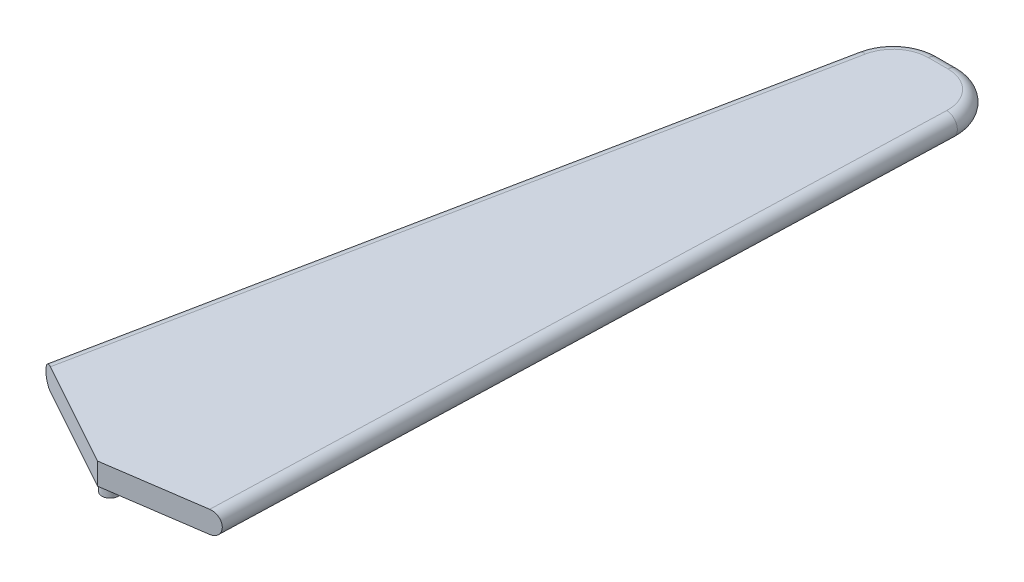
ISO-10303-21;
HEADER;
FILE_DESCRIPTION(('STEP AP214'),'2;1');
FILE_NAME('part.step','',(''),(''),'','','');
FILE_SCHEMA(('AUTOMOTIVE_DESIGN { 1 0 10303 214 1 1 1 1 }'));
ENDSEC;
DATA;
#1=APPLICATION_CONTEXT('core data for automotive mechanical design processes');
#2=APPLICATION_PROTOCOL_DEFINITION('international standard','automotive_design',2000,#1);
#3=PRODUCT_CONTEXT('',#1,'mechanical');
#4=PRODUCT('Part','Part','',(#3));
#5=PRODUCT_RELATED_PRODUCT_CATEGORY('part','',(#4));
#6=PRODUCT_DEFINITION_FORMATION('','',#4);
#7=PRODUCT_DEFINITION_CONTEXT('part definition',#1,'design');
#8=PRODUCT_DEFINITION('design','',#6,#7);
#9=PRODUCT_DEFINITION_SHAPE('','',#8);
#10=(LENGTH_UNIT() NAMED_UNIT(*) SI_UNIT(.MILLI.,.METRE.));
#11=(NAMED_UNIT(*) PLANE_ANGLE_UNIT() SI_UNIT($,.RADIAN.));
#12=(NAMED_UNIT(*) SI_UNIT($,.STERADIAN.) SOLID_ANGLE_UNIT());
#13=UNCERTAINTY_MEASURE_WITH_UNIT(LENGTH_MEASURE(1.E-05),#10,'distance_accuracy_value','');
#14=(GEOMETRIC_REPRESENTATION_CONTEXT(3) GLOBAL_UNCERTAINTY_ASSIGNED_CONTEXT((#13)) GLOBAL_UNIT_ASSIGNED_CONTEXT((#10,
#11,#12)) REPRESENTATION_CONTEXT('',''));
#15=CARTESIAN_POINT('',(0.,0.,0.));
#16=DIRECTION('',(0.,0.,1.));
#17=DIRECTION('',(1.,0.,0.));
#18=AXIS2_PLACEMENT_3D('',#15,#16,#17);
#19=CARTESIAN_POINT('',(268.196602974786,2.03230311549263,-4129.34647355135));
#20=DIRECTION('',(-0.0324574224863684,0.,0.999473119061009));
#21=DIRECTION('',(-0.999473119061009,0.,-0.0324574224863684));
#22=AXIS2_PLACEMENT_3D('',#19,#20,#21);
#23=CYLINDRICAL_SURFACE('',#22,30.);
#24=CARTESIAN_POINT('',(204.415988201948,2.03230311549263,-2165.3269951282));
#25=DIRECTION('',(0.144215427871348,0.,0.989546315421307));
#26=DIRECTION('',(-0.989546315421307,0.,0.144215427871348));
#27=AXIS2_PLACEMENT_3D('',#24,#25,#26);
#28=ELLIPSE('',#27,30.477147748641,30.);
#29=CARTESIAN_POINT('',(204.415988201949,32.0323031154927,-2165.3269951282));
#30=VERTEX_POINT('',#29);
#31=CARTESIAN_POINT('',(204.415988201949,-27.9676968845074,-2165.3269951282));
#32=VERTEX_POINT('',#31);
#33=EDGE_CURVE('E194',#30,#32,#28,.F.);
#34=ORIENTED_EDGE('',*,*,#33,.T.);
#35=DIRECTION('',(0.0324574224863683,0.,-0.999473119061009));
#36=VECTOR('',#35,1.);
#37=CARTESIAN_POINT('',(268.196602974786,-27.9676968845074,-4129.34647355135));
#38=LINE('',#37,#36);
#39=CARTESIAN_POINT('',(268.196602974786,-27.9676968845074,-4129.34647355135));
#40=VERTEX_POINT('',#39);
#41=EDGE_CURVE('E179',#32,#40,#38,.T.);
#42=ORIENTED_EDGE('',*,*,#41,.T.);
#43=CARTESIAN_POINT('',(268.196602974786,2.03230311549263,-4129.34647355135));
#44=DIRECTION('',(0.0324574224863684,0.,-0.999473119061009));
#45=DIRECTION('',(-0.999473119061009,0.,-0.0324574224863684));
#46=AXIS2_PLACEMENT_3D('',#43,#44,#45);
#47=CIRCLE('',#46,30.);
#48=CARTESIAN_POINT('',(268.196602974786,32.0323031154926,-4129.34647355135));
#49=VERTEX_POINT('',#48);
#50=EDGE_CURVE('E12',#49,#40,#47,.T.);
#51=ORIENTED_EDGE('',*,*,#50,.F.);
#52=DIRECTION('',(-0.0324574224863683,0.,0.999473119061009));
#53=VECTOR('',#52,1.);
#54=CARTESIAN_POINT('',(196.275096440999,32.0323031154926,-1914.64157845126));
#55=LINE('',#54,#53);
#56=EDGE_CURVE('E171',#49,#30,#55,.T.);
#57=ORIENTED_EDGE('',*,*,#56,.T.);
#58=EDGE_LOOP('',(#34,#42,#51,#57));
#59=FACE_BOUND('',#58,.T.);
#60=ADVANCED_FACE('F45',(#59),#23,.T.);
#61=CARTESIAN_POINT('',(170.747973866338,2.03230311549263,-4132.51107224377));
#62=DIRECTION('',(0.,1.,0.));
#63=DIRECTION('',(0.,0.,-1.));
#64=AXIS2_PLACEMENT_3D('',#61,#62,#63);
#65=TOROIDAL_SURFACE('',#64,97.5,30.);
#66=CARTESIAN_POINT('',(170.747973866338,2.03230311549263,-4230.01107224377));
#67=DIRECTION('',(-1.,0.,0.));
#68=DIRECTION('',(0.,1.,0.));
#69=AXIS2_PLACEMENT_3D('',#66,#67,#68);
#70=CIRCLE('',#69,30.);
#71=CARTESIAN_POINT('',(170.747973866338,32.0323031154926,-4230.01107224377));
#72=VERTEX_POINT('',#71);
#73=CARTESIAN_POINT('',(170.747973866338,-27.9676968845074,-4230.01107224377));
#74=VERTEX_POINT('',#73);
#75=EDGE_CURVE('E56',#72,#74,#70,.T.);
#76=ORIENTED_EDGE('',*,*,#75,.F.);
#77=CARTESIAN_POINT('',(170.747973866338,32.0323031154926,-4132.51107224377));
#78=DIRECTION('',(0.,-1.,0.));
#79=DIRECTION('',(0.,0.,-1.));
#80=AXIS2_PLACEMENT_3D('',#77,#78,#79);
#81=CIRCLE('',#80,97.5);
#82=EDGE_CURVE('E165',#72,#49,#81,.T.);
#83=ORIENTED_EDGE('',*,*,#82,.T.);
#84=ORIENTED_EDGE('',*,*,#50,.T.);
#85=CARTESIAN_POINT('',(170.747973866338,-27.9676968845074,-4132.51107224377));
#86=DIRECTION('',(0.,1.,0.));
#87=DIRECTION('',(0.,0.,-1.));
#88=AXIS2_PLACEMENT_3D('',#85,#86,#87);
#89=CIRCLE('',#88,97.5);
#90=EDGE_CURVE('E122',#40,#74,#89,.T.);
#91=ORIENTED_EDGE('',*,*,#90,.T.);
#92=EDGE_LOOP('',(#76,#83,#84,#91));
#93=FACE_BOUND('',#92,.T.);
#94=ADVANCED_FACE('F284',(#93),#65,.T.);
#95=CARTESIAN_POINT('',(117.204501411974,2.03230311549263,-4230.01107224377));
#96=DIRECTION('',(1.,0.,0.));
#97=DIRECTION('',(0.,0.,1.));
#98=AXIS2_PLACEMENT_3D('',#95,#96,#97);
#99=CYLINDRICAL_SURFACE('',#98,30.);
#100=CARTESIAN_POINT('',(117.204501411973,2.03230311549263,-4230.01107224377));
#101=DIRECTION('',(-1.,0.,0.));
#102=DIRECTION('',(0.,1.,0.));
#103=AXIS2_PLACEMENT_3D('',#100,#101,#102);
#104=CIRCLE('',#103,30.);
#105=CARTESIAN_POINT('',(117.204501411974,32.0323031154926,-4230.01107224377));
#106=VERTEX_POINT('',#105);
#107=CARTESIAN_POINT('',(117.204501411974,-27.9676968845074,-4230.01107224377));
#108=VERTEX_POINT('',#107);
#109=EDGE_CURVE('E119',#106,#108,#104,.T.);
#110=ORIENTED_EDGE('',*,*,#109,.F.);
#111=DIRECTION('',(1.,0.,0.));
#112=VECTOR('',#111,1.);
#113=CARTESIAN_POINT('',(170.747973866338,32.0323031154926,-4230.01107224377));
#114=LINE('',#113,#112);
#115=EDGE_CURVE('E163',#106,#72,#114,.T.);
#116=ORIENTED_EDGE('',*,*,#115,.T.);
#117=ORIENTED_EDGE('',*,*,#75,.T.);
#118=DIRECTION('',(-1.,0.,0.));
#119=VECTOR('',#118,1.);
#120=CARTESIAN_POINT('',(170.747973866338,-27.9676968845074,-4230.01107224377));
#121=LINE('',#120,#119);
#122=EDGE_CURVE('E105',#74,#108,#121,.T.);
#123=ORIENTED_EDGE('',*,*,#122,.T.);
#124=EDGE_LOOP('',(#110,#116,#117,#123));
#125=FACE_BOUND('',#124,.T.);
#126=ADVANCED_FACE('F117',(#125),#99,.T.);
#127=CARTESIAN_POINT('',(117.204501411973,2.03230311549263,-4132.51107224377));
#128=DIRECTION('',(0.,1.,0.));
#129=DIRECTION('',(0.,0.,-1.));
#130=AXIS2_PLACEMENT_3D('',#127,#128,#129);
#131=TOROIDAL_SURFACE('',#130,97.5,30.);
#132=CARTESIAN_POINT('',(21.6249774605723,2.03230311549263,-4151.76735956048));
#133=DIRECTION('',(-0.197500382735413,0.,0.980302809757967));
#134=DIRECTION('',(0.980302809757967,0.,0.197500382735413));
#135=AXIS2_PLACEMENT_3D('',#132,#133,#134);
#136=CIRCLE('',#135,30.);
#137=CARTESIAN_POINT('',(21.6249774605723,32.0323031154926,-4151.76735956048));
#138=VERTEX_POINT('',#137);
#139=CARTESIAN_POINT('',(21.6249774605723,-27.9676968845074,-4151.76735956048));
#140=VERTEX_POINT('',#139);
#141=EDGE_CURVE('E137',#138,#140,#136,.T.);
#142=ORIENTED_EDGE('',*,*,#141,.F.);
#143=CARTESIAN_POINT('',(117.204501411973,32.0323031154926,-4132.51107224377));
#144=DIRECTION('',(0.,-1.,0.));
#145=DIRECTION('',(0.,0.,-1.));
#146=AXIS2_PLACEMENT_3D('',#143,#144,#145);
#147=CIRCLE('',#146,97.5);
#148=EDGE_CURVE('E126',#138,#106,#147,.T.);
#149=ORIENTED_EDGE('',*,*,#148,.T.);
#150=ORIENTED_EDGE('',*,*,#109,.T.);
#151=CARTESIAN_POINT('',(117.204501411973,-27.9676968845074,-4132.51107224377));
#152=DIRECTION('',(0.,1.,0.));
#153=DIRECTION('',(0.,0.,-1.));
#154=AXIS2_PLACEMENT_3D('',#151,#152,#153);
#155=CIRCLE('',#154,97.5);
#156=EDGE_CURVE('E101',#108,#140,#155,.T.);
#157=ORIENTED_EDGE('',*,*,#156,.T.);
#158=EDGE_LOOP('',(#142,#149,#150,#157));
#159=FACE_BOUND('',#158,.T.);
#160=ADVANCED_FACE('F124',(#159),#131,.T.);
#161=CARTESIAN_POINT('',(-351.312110343913,32.0323031154926,-2300.6758833102));
#162=DIRECTION('',(0.,-1.,0.));
#163=DIRECTION('',(0.,0.,1.));
#164=AXIS2_PLACEMENT_3D('',#161,#162,#163);
#165=CYLINDRICAL_SURFACE('',#164,30.);
#166=DIRECTION('',(0.,1.,0.));
#167=VECTOR('',#166,1.);
#168=CARTESIAN_POINT('',(-381.312110343913,32.0323031154926,-2300.6758833102));
#169=LINE('',#168,#167);
#170=CARTESIAN_POINT('',(-381.312110343913,-3.89270836656975,-2300.6758833102));
#171=VERTEX_POINT('',#170);
#172=CARTESIAN_POINT('',(-381.312110343913,7.95731459755501,-2300.6758833102));
#173=VERTEX_POINT('',#172);
#174=EDGE_CURVE('E157',#171,#173,#169,.T.);
#175=ORIENTED_EDGE('',*,*,#174,.T.);
#176=CARTESIAN_POINT('',(-381.312110343913,7.957314597555,-2300.6758833102));
#177=CARTESIAN_POINT('',(-381.312110343913,6.00518340970653,-2302.66723860208));
#178=CARTESIAN_POINT('',(-381.114488068959,4.02365840736429,-2304.64876360442));
#179=CARTESIAN_POINT('',(-380.721194636652,2.03230311549263,-2306.60089479226));
#180=(BOUNDED_CURVE() B_SPLINE_CURVE(3,(#176,#177,#178,#179),.UNSPECIFIED.,.F.,
.F.) B_SPLINE_CURVE_WITH_KNOTS((4,4),(1.37198890603889,1.5707963267949),
.UNSPECIFIED.) CURVE() GEOMETRIC_REPRESENTATION_ITEM() RATIONAL_B_SPLINE_CURVE((1.,
0.99670901200819,0.99670901200819,1.)) REPRESENTATION_ITEM(''));
#181=CARTESIAN_POINT('',(-380.721194636652,2.03230311549263,-2306.60089479226));
#182=VERTEX_POINT('',#181);
#183=EDGE_CURVE('E129',#173,#182,#180,.T.);
#184=ORIENTED_EDGE('',*,*,#183,.T.);
#185=CARTESIAN_POINT('',(-381.312110343913,-3.89270836656975,-2300.6758833102));
#186=CARTESIAN_POINT('',(-381.312110343914,-1.94057717872148,-2302.66723860207));
#187=CARTESIAN_POINT('',(-381.11448806896,0.0409478236208545,-2304.64876360442));
#188=CARTESIAN_POINT('',(-380.721194636652,2.03230311549263,-2306.60089479226));
#189=(BOUNDED_CURVE() B_SPLINE_CURVE(3,(#185,#186,#187,#188),.UNSPECIFIED.,.F.,
.F.) B_SPLINE_CURVE_WITH_KNOTS((4,4),(4.51358155962868,4.71238898038469),
.UNSPECIFIED.) CURVE() GEOMETRIC_REPRESENTATION_ITEM() RATIONAL_B_SPLINE_CURVE((1.,
0.996709012008189,0.996709012008189,1.)) REPRESENTATION_ITEM(''));
#190=EDGE_CURVE('E69',#171,#182,#189,.T.);
#191=ORIENTED_EDGE('',*,*,#190,.F.);
#192=EDGE_LOOP('',(#175,#184,#191));
#193=FACE_BOUND('',#192,.T.);
#194=ADVANCED_FACE('F238',(#193),#165,.T.);
#195=CARTESIAN_POINT('',(-351.903026051175,2.03230311549263,-2297.74284429461));
#196=DIRECTION('',(0.197500382735416,0.,-0.980302809757967));
#197=DIRECTION('',(0.980302809757967,0.,0.197500382735416));
#198=AXIS2_PLACEMENT_3D('',#195,#196,#197);
#199=CYLINDRICAL_SURFACE('',#198,30.);
#200=CARTESIAN_POINT('',(-354.312128170104,2.03230311549263,-2285.78514809437));
#201=DIRECTION('',(-0.482932962853046,0.,0.875657326463942));
#202=DIRECTION('',(-0.875657326463942,0.,-0.482932962853046));
#203=AXIS2_PLACEMENT_3D('',#200,#201,#202);
#204=ELLIPSE('',#203,31.4535047485446,30.);
#205=CARTESIAN_POINT('',(-354.312128170103,32.0323031154927,-2285.78514809437));
#206=VERTEX_POINT('',#205);
#207=EDGE_CURVE('E211',#173,#206,#204,.F.);
#208=ORIENTED_EDGE('',*,*,#207,.T.);
#209=DIRECTION('',(0.197500382735414,0.,-0.980302809757967));
#210=VECTOR('',#209,1.);
#211=CARTESIAN_POINT('',(21.6249774605723,32.0323031154926,-4151.76735956048));
#212=LINE('',#211,#210);
#213=EDGE_CURVE('E144',#206,#138,#212,.T.);
#214=ORIENTED_EDGE('',*,*,#213,.T.);
#215=ORIENTED_EDGE('',*,*,#141,.T.);
#216=DIRECTION('',(-0.197500382735414,0.,0.980302809757967));
#217=VECTOR('',#216,1.);
#218=CARTESIAN_POINT('',(23.7135156277316,-27.9676968845074,-4162.13392090682));
#219=LINE('',#218,#217);
#220=CARTESIAN_POINT('',(-354.312128170103,-27.9676968845074,-2285.78514809437));
#221=VERTEX_POINT('',#220);
#222=EDGE_CURVE('E49',#140,#221,#219,.T.);
#223=ORIENTED_EDGE('',*,*,#222,.T.);
#224=EDGE_CURVE('E215',#221,#171,#204,.F.);
#225=ORIENTED_EDGE('',*,*,#224,.T.);
#226=ORIENTED_EDGE('',*,*,#190,.T.);
#227=ORIENTED_EDGE('',*,*,#183,.F.);
#228=EDGE_LOOP('',(#208,#214,#215,#223,#225,#226,#227));
#229=FACE_BOUND('',#228,.T.);
#230=ADVANCED_FACE('F47',(#229),#199,.T.);
#231=CARTESIAN_POINT('',(170.747973866338,-27.9676968845074,-4132.51107224377));
#232=DIRECTION('',(0.,1.,0.));
#233=DIRECTION('',(1.,0.,0.));
#234=AXIS2_PLACEMENT_3D('',#231,#232,#233);
#235=PLANE('',#234);
#236=CARTESIAN_POINT('',(-64.764376239432,-27.9676968845074,-2160.63468606479));
#237=DIRECTION('',(0.,-1.,0.));
#238=DIRECTION('',(0.,0.,-1.));
#239=AXIS2_PLACEMENT_3D('',#236,#237,#238);
#240=CIRCLE('',#239,22.5);
#241=CARTESIAN_POINT('',(-64.764376239432,-27.9676968845074,-2183.13468606479));
#242=VERTEX_POINT('',#241);
#243=EDGE_CURVE('E210',#242,#242,#240,.T.);
#244=ORIENTED_EDGE('',*,*,#243,.F.);
#245=EDGE_LOOP('',(#244));
#246=FACE_BOUND('',#245,.T.);
#247=ORIENTED_EDGE('',*,*,#222,.F.);
#248=ORIENTED_EDGE('',*,*,#156,.F.);
#249=ORIENTED_EDGE('',*,*,#122,.F.);
#250=ORIENTED_EDGE('',*,*,#90,.F.);
#251=ORIENTED_EDGE('',*,*,#41,.F.);
#252=DIRECTION('',(-0.989546315421307,0.,0.144215427871348));
#253=VECTOR('',#252,1.);
#254=CARTESIAN_POINT('',(-64.764376239432,-27.9676968845074,-2126.09693502136));
#255=LINE('',#254,#253);
#256=CARTESIAN_POINT('',(-64.764376239432,-27.9676968845074,-2126.09693502136));
#257=VERTEX_POINT('',#256);
#258=EDGE_CURVE('E208',#32,#257,#255,.T.);
#259=ORIENTED_EDGE('',*,*,#258,.T.);
#260=DIRECTION('',(-0.875657326463942,0.,-0.482932962853046));
#261=VECTOR('',#260,1.);
#262=CARTESIAN_POINT('',(-381.312110343913,-27.9676968845074,-2300.6758833102));
#263=LINE('',#262,#261);
#264=EDGE_CURVE('E221',#257,#221,#263,.T.);
#265=ORIENTED_EDGE('',*,*,#264,.T.);
#266=EDGE_LOOP('',(#247,#248,#249,#250,#251,#259,#265));
#267=FACE_BOUND('',#266,.T.);
#268=ADVANCED_FACE('F103',(#246,#267),#235,.F.);
#269=CARTESIAN_POINT('',(170.747973866338,32.0323031154926,-4132.51107224377));
#270=DIRECTION('',(0.,1.,0.));
#271=DIRECTION('',(1.,0.,0.));
#272=AXIS2_PLACEMENT_3D('',#269,#270,#271);
#273=PLANE('',#272);
#274=DIRECTION('',(-0.875657326463942,0.,-0.482932962853046));
#275=VECTOR('',#274,1.);
#276=CARTESIAN_POINT('',(-381.312110343913,32.0323031154927,-2300.6758833102));
#277=LINE('',#276,#275);
#278=CARTESIAN_POINT('',(-64.764376239432,32.0323031154927,-2126.09693502136));
#279=VERTEX_POINT('',#278);
#280=EDGE_CURVE('E220',#279,#206,#277,.T.);
#281=ORIENTED_EDGE('',*,*,#280,.F.);
#282=DIRECTION('',(-0.989546315421307,0.,0.144215427871348));
#283=VECTOR('',#282,1.);
#284=CARTESIAN_POINT('',(-64.764376239432,32.0323031154927,-2126.09693502136));
#285=LINE('',#284,#283);
#286=EDGE_CURVE('E205',#30,#279,#285,.T.);
#287=ORIENTED_EDGE('',*,*,#286,.F.);
#288=ORIENTED_EDGE('',*,*,#56,.F.);
#289=ORIENTED_EDGE('',*,*,#82,.F.);
#290=ORIENTED_EDGE('',*,*,#115,.F.);
#291=ORIENTED_EDGE('',*,*,#148,.F.);
#292=ORIENTED_EDGE('',*,*,#213,.F.);
#293=EDGE_LOOP('',(#281,#287,#288,#289,#290,#291,#292));
#294=FACE_BOUND('',#293,.T.);
#295=ADVANCED_FACE('F235',(#294),#273,.T.);
#296=CARTESIAN_POINT('',(-64.764376239432,-57.9676968845074,-2160.63468606479));
#297=DIRECTION('',(0.,1.,0.));
#298=DIRECTION('',(0.,0.,-1.));
#299=AXIS2_PLACEMENT_3D('',#296,#297,#298);
#300=CYLINDRICAL_SURFACE('',#299,22.5);
#301=CARTESIAN_POINT('',(-64.764376239432,-57.9676968845074,-2160.63468606479));
#302=DIRECTION('',(0.,-1.,0.));
#303=DIRECTION('',(0.,0.,-1.));
#304=AXIS2_PLACEMENT_3D('',#301,#302,#303);
#305=CIRCLE('',#304,22.5);
#306=CARTESIAN_POINT('',(-64.764376239432,-57.9676968845074,-2183.13468606479));
#307=VERTEX_POINT('',#306);
#308=EDGE_CURVE('E162',#307,#307,#305,.T.);
#309=ORIENTED_EDGE('',*,*,#308,.F.);
#310=EDGE_LOOP('',(#309));
#311=FACE_BOUND('',#310,.T.);
#312=ORIENTED_EDGE('',*,*,#243,.T.);
#313=EDGE_LOOP('',(#312));
#314=FACE_BOUND('',#313,.T.);
#315=ADVANCED_FACE('F332',(#311,#314),#300,.T.);
#316=CARTESIAN_POINT('',(-42.264376239432,-57.9676968845074,-2160.63468606479));
#317=DIRECTION('',(0.,-1.,0.));
#318=DIRECTION('',(0.,0.,1.));
#319=AXIS2_PLACEMENT_3D('',#316,#317,#318);
#320=PLANE('',#319);
#321=ORIENTED_EDGE('',*,*,#308,.T.);
#322=EDGE_LOOP('',(#321));
#323=FACE_BOUND('',#322,.T.);
#324=ADVANCED_FACE('F440',(#323),#320,.T.);
#325=CARTESIAN_POINT('',(-381.312110343913,32.0323031154927,-2300.6758833102));
#326=DIRECTION('',(0.482932962853046,0.,-0.875657326463942));
#327=DIRECTION('',(0.875657326463942,0.,0.482932962853046));
#328=AXIS2_PLACEMENT_3D('',#325,#326,#327);
#329=PLANE('',#328);
#330=ORIENTED_EDGE('',*,*,#207,.F.);
#331=ORIENTED_EDGE('',*,*,#174,.F.);
#332=ORIENTED_EDGE('',*,*,#224,.F.);
#333=ORIENTED_EDGE('',*,*,#264,.F.);
#334=DIRECTION('',(0.,-1.,0.));
#335=VECTOR('',#334,1.);
#336=CARTESIAN_POINT('',(-64.764376239432,32.0323031154927,-2126.09693502136));
#337=LINE('',#336,#335);
#338=EDGE_CURVE('E218',#279,#257,#337,.T.);
#339=ORIENTED_EDGE('',*,*,#338,.F.);
#340=ORIENTED_EDGE('',*,*,#280,.T.);
#341=EDGE_LOOP('',(#330,#331,#332,#333,#339,#340));
#342=FACE_BOUND('',#341,.T.);
#343=ADVANCED_FACE('F230',(#342),#329,.F.);
#344=CARTESIAN_POINT('',(-64.764376239432,32.0323031154927,-2126.09693502136));
#345=DIRECTION('',(-0.144215427871348,0.,-0.989546315421307));
#346=DIRECTION('',(0.989546315421307,0.,-0.144215427871348));
#347=AXIS2_PLACEMENT_3D('',#344,#345,#346);
#348=PLANE('',#347);
#349=ORIENTED_EDGE('',*,*,#33,.F.);
#350=ORIENTED_EDGE('',*,*,#286,.T.);
#351=ORIENTED_EDGE('',*,*,#338,.T.);
#352=ORIENTED_EDGE('',*,*,#258,.F.);
#353=EDGE_LOOP('',(#349,#350,#351,#352));
#354=FACE_BOUND('',#353,.T.);
#355=ADVANCED_FACE('F202',(#354),#348,.F.);
#356=CLOSED_SHELL('',(#60,#94,#126,#160,#194,#230,#268,#295,#315,#324,#343,#355));
#357=MANIFOLD_SOLID_BREP('B2',#356);
#358=ADVANCED_BREP_SHAPE_REPRESENTATION('',(#18,#357),#14);
#359=SHAPE_DEFINITION_REPRESENTATION(#9,#358);
ENDSEC;
END-ISO-10303-21;
